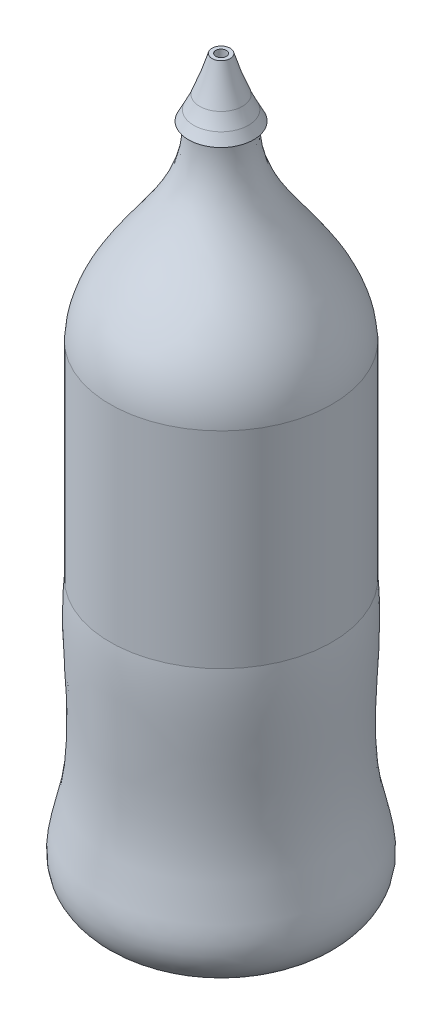
ISO-10303-21;
HEADER;
FILE_DESCRIPTION(('STEP AP214'),'2;1');
FILE_NAME('part.step','',(''),(''),'','','');
FILE_SCHEMA(('AUTOMOTIVE_DESIGN { 1 0 10303 214 1 1 1 1 }'));
ENDSEC;
DATA;
#1=APPLICATION_CONTEXT('core data for automotive mechanical design processes');
#2=APPLICATION_PROTOCOL_DEFINITION('international standard','automotive_design',2000,#1);
#3=PRODUCT_CONTEXT('',#1,'mechanical');
#4=PRODUCT('Part','Part','',(#3));
#5=PRODUCT_RELATED_PRODUCT_CATEGORY('part','',(#4));
#6=PRODUCT_DEFINITION_FORMATION('','',#4);
#7=PRODUCT_DEFINITION_CONTEXT('part definition',#1,'design');
#8=PRODUCT_DEFINITION('design','',#6,#7);
#9=PRODUCT_DEFINITION_SHAPE('','',#8);
#10=(LENGTH_UNIT() NAMED_UNIT(*) SI_UNIT(.MILLI.,.METRE.));
#11=(NAMED_UNIT(*) PLANE_ANGLE_UNIT() SI_UNIT($,.RADIAN.));
#12=(NAMED_UNIT(*) SI_UNIT($,.STERADIAN.) SOLID_ANGLE_UNIT());
#13=UNCERTAINTY_MEASURE_WITH_UNIT(LENGTH_MEASURE(1.E-05),#10,'distance_accuracy_value','');
#14=(GEOMETRIC_REPRESENTATION_CONTEXT(3) GLOBAL_UNCERTAINTY_ASSIGNED_CONTEXT((#13)) GLOBAL_UNIT_ASSIGNED_CONTEXT((#10,
#11,#12)) REPRESENTATION_CONTEXT('',''));
#15=CARTESIAN_POINT('',(0.,0.,0.));
#16=DIRECTION('',(0.,0.,1.));
#17=DIRECTION('',(1.,0.,0.));
#18=AXIS2_PLACEMENT_3D('',#15,#16,#17);
#19=CARTESIAN_POINT('',(0.,0.,0.));
#20=DIRECTION('',(0.,-1.,0.));
#21=DIRECTION('',(0.,0.,-1.));
#22=AXIS2_PLACEMENT_3D('',#19,#20,#21);
#23=PLANE('',#22);
#24=CARTESIAN_POINT('',(0.,0.,0.));
#25=DIRECTION('',(0.,-1.,0.));
#26=DIRECTION('',(0.,0.,-1.));
#27=AXIS2_PLACEMENT_3D('',#24,#25,#26);
#28=CIRCLE('',#27,44.2878933126707);
#29=CARTESIAN_POINT('',(0.,0.,-44.2878933126707));
#30=VERTEX_POINT('',#29);
#31=EDGE_CURVE('E10',#30,#30,#28,.T.);
#32=ORIENTED_EDGE('',*,*,#31,.T.);
#33=EDGE_LOOP('',(#32));
#34=FACE_BOUND('',#33,.T.);
#35=ADVANCED_FACE('F35',(#34),#23,.T.);
#36=CARTESIAN_POINT('',(44.2878933126707,0.,0.));
#37=CARTESIAN_POINT('',(64.997390407619,10.7682458448308,0.));
#38=CARTESIAN_POINT('',(44.2480995941427,56.60135594638,0.));
#39=CARTESIAN_POINT('',(55.2454776336469,101.880070942648,0.));
#40=CARTESIAN_POINT('',(52.5674885243035,132.323370386274,0.));
#41=B_SPLINE_CURVE_WITH_KNOTS('',3,(#36,#37,#38,#39,#40),.UNSPECIFIED.,.F.,.F.,(4,1,4),(0.,
0.337509044178873,1.),.UNSPECIFIED.);
#42=CARTESIAN_POINT('',(0.,0.,0.));
#43=DIRECTION('',(0.,-1.,0.));
#44=AXIS1_PLACEMENT('',#42,#43);
#45=SURFACE_OF_REVOLUTION('',#41,#44);
#46=CARTESIAN_POINT('',(0.,132.323370386274,0.));
#47=DIRECTION('',(0.,-1.,0.));
#48=DIRECTION('',(0.,0.,-1.));
#49=AXIS2_PLACEMENT_3D('',#46,#47,#48);
#50=CIRCLE('',#49,52.5674885243035);
#51=CARTESIAN_POINT('',(0.,132.323370386274,-52.5674885243035));
#52=VERTEX_POINT('',#51);
#53=EDGE_CURVE('E41',#52,#52,#50,.T.);
#54=ORIENTED_EDGE('',*,*,#53,.T.);
#55=EDGE_LOOP('',(#54));
#56=FACE_BOUND('',#55,.T.);
#57=ORIENTED_EDGE('',*,*,#31,.F.);
#58=EDGE_LOOP('',(#57));
#59=FACE_BOUND('',#58,.T.);
#60=ADVANCED_FACE('F76',(#56,#59),#45,.F.);
#61=CARTESIAN_POINT('',(0.,0.,0.));
#62=DIRECTION('',(0.,-1.,0.));
#63=DIRECTION('',(0.,0.,-1.));
#64=AXIS2_PLACEMENT_3D('',#61,#62,#63);
#65=CYLINDRICAL_SURFACE('',#64,52.5674885243035);
#66=CARTESIAN_POINT('',(0.,229.937180408608,0.));
#67=DIRECTION('',(0.,-1.,0.));
#68=DIRECTION('',(0.,0.,-1.));
#69=AXIS2_PLACEMENT_3D('',#66,#67,#68);
#70=CIRCLE('',#69,52.5674885243035);
#71=CARTESIAN_POINT('',(0.,229.937180408608,-52.5674885243035));
#72=VERTEX_POINT('',#71);
#73=EDGE_CURVE('E45',#72,#72,#70,.T.);
#74=ORIENTED_EDGE('',*,*,#73,.T.);
#75=EDGE_LOOP('',(#74));
#76=FACE_BOUND('',#75,.T.);
#77=ORIENTED_EDGE('',*,*,#53,.F.);
#78=EDGE_LOOP('',(#77));
#79=FACE_BOUND('',#78,.T.);
#80=ADVANCED_FACE('F72',(#76,#79),#65,.T.);
#81=CARTESIAN_POINT('',(52.5674885243035,229.937180408608,0.));
#82=CARTESIAN_POINT('',(50.721966152257,265.475319411819,0.));
#83=CARTESIAN_POINT('',(11.8780918355514,283.278325470359,0.));
#84=CARTESIAN_POINT('',(13.,320.,0.));
#85=B_SPLINE_CURVE_WITH_KNOTS('',3,(#81,#82,#83,#84),.UNSPECIFIED.,.F.,.F.,(4,4),(0.,1.),.UNSPECIFIED.);
#86=CARTESIAN_POINT('',(0.,0.,0.));
#87=DIRECTION('',(0.,-1.,0.));
#88=AXIS1_PLACEMENT('',#86,#87);
#89=SURFACE_OF_REVOLUTION('',#85,#88);
#90=CARTESIAN_POINT('',(0.,320.,0.));
#91=DIRECTION('',(0.,-1.,0.));
#92=DIRECTION('',(0.,0.,-1.));
#93=AXIS2_PLACEMENT_3D('',#90,#91,#92);
#94=CIRCLE('',#93,13.);
#95=CARTESIAN_POINT('',(0.,320.,-13.));
#96=VERTEX_POINT('',#95);
#97=EDGE_CURVE('E49',#96,#96,#94,.T.);
#98=ORIENTED_EDGE('',*,*,#97,.T.);
#99=EDGE_LOOP('',(#98));
#100=FACE_BOUND('',#99,.T.);
#101=ORIENTED_EDGE('',*,*,#73,.F.);
#102=EDGE_LOOP('',(#101));
#103=FACE_BOUND('',#102,.T.);
#104=ADVANCED_FACE('F67',(#100,#103),#89,.F.);
#105=CARTESIAN_POINT('',(15.433464657022,320.,0.));
#106=DIRECTION('',(0.,-1.,0.));
#107=DIRECTION('',(0.,0.,-1.));
#108=AXIS2_PLACEMENT_3D('',#105,#106,#107);
#109=PLANE('',#108);
#110=CARTESIAN_POINT('',(0.,320.,0.));
#111=DIRECTION('',(0.,1.,0.));
#112=DIRECTION('',(-1.,0.,0.));
#113=AXIS2_PLACEMENT_3D('',#110,#111,#112);
#114=CIRCLE('',#113,15.433464657022);
#115=CARTESIAN_POINT('',(-15.433464657022,320.,0.));
#116=VERTEX_POINT('',#115);
#117=EDGE_CURVE('E54',#116,#116,#114,.T.);
#118=ORIENTED_EDGE('',*,*,#117,.F.);
#119=EDGE_LOOP('',(#118));
#120=FACE_BOUND('',#119,.T.);
#121=ORIENTED_EDGE('',*,*,#97,.F.);
#122=EDGE_LOOP('',(#121));
#123=FACE_BOUND('',#122,.T.);
#124=ADVANCED_FACE('F71',(#120,#123),#109,.T.);
#125=CARTESIAN_POINT('',(0.,383.511624279016,0.));
#126=DIRECTION('',(0.,1.,0.));
#127=DIRECTION('',(-1.,0.,0.));
#128=AXIS2_PLACEMENT_3D('',#125,#126,#127);
#129=DEGENERATE_TOROIDAL_SURFACE('',#128,133.383744729514,133.962662662916,.T.);
#130=CARTESIAN_POINT('',(0.,324.743018777121,0.));
#131=DIRECTION('',(0.,-1.,0.));
#132=DIRECTION('',(1.,0.,0.));
#133=AXIS2_PLACEMENT_3D('',#130,#131,#132);
#134=CIRCLE('',#133,13.);
#135=CARTESIAN_POINT('',(13.,324.743018777121,0.));
#136=VERTEX_POINT('',#135);
#137=EDGE_CURVE('E190',#136,#136,#134,.T.);
#138=ORIENTED_EDGE('',*,*,#137,.T.);
#139=EDGE_LOOP('',(#138));
#140=FACE_BOUND('',#139,.T.);
#141=ORIENTED_EDGE('',*,*,#117,.T.);
#142=EDGE_LOOP('',(#141));
#143=FACE_BOUND('',#142,.T.);
#144=ADVANCED_FACE('F112',(#140,#143),#129,.F.);
#145=CARTESIAN_POINT('',(9.91901574854125,331.054218753293,0.));
#146=DIRECTION('',(0.,1.,0.));
#147=DIRECTION('',(-1.,0.,0.));
#148=AXIS2_PLACEMENT_3D('',#145,#146,#147);
#149=PLANE('',#148);
#150=CARTESIAN_POINT('',(0.,331.054218753293,0.));
#151=DIRECTION('',(0.,-1.,0.));
#152=DIRECTION('',(1.,0.,0.));
#153=AXIS2_PLACEMENT_3D('',#150,#151,#152);
#154=CIRCLE('',#153,9.91901574854124);
#155=CARTESIAN_POINT('',(9.91901574854125,331.054218753293,0.));
#156=VERTEX_POINT('',#155);
#157=EDGE_CURVE('E194',#156,#156,#154,.T.);
#158=ORIENTED_EDGE('',*,*,#157,.F.);
#159=EDGE_LOOP('',(#158));
#160=FACE_BOUND('',#159,.T.);
#161=CARTESIAN_POINT('',(0.,331.054218753293,0.));
#162=DIRECTION('',(0.,-1.,0.));
#163=DIRECTION('',(1.,0.,0.));
#164=AXIS2_PLACEMENT_3D('',#161,#162,#163);
#165=CIRCLE('',#164,10.1189257694876);
#166=CARTESIAN_POINT('',(10.1189257694876,331.054218753293,0.));
#167=VERTEX_POINT('',#166);
#168=EDGE_CURVE('E201',#167,#167,#165,.F.);
#169=ORIENTED_EDGE('',*,*,#168,.F.);
#170=EDGE_LOOP('',(#169));
#171=FACE_BOUND('',#170,.T.);
#172=ADVANCED_FACE('F122',(#160,#171),#149,.F.);
#173=CARTESIAN_POINT('',(0.,356.803646010612,0.));
#174=DIRECTION('',(0.,-1.,0.));
#175=DIRECTION('',(1.,0.,0.));
#176=AXIS2_PLACEMENT_3D('',#173,#174,#175);
#177=TOROIDAL_SURFACE('',#176,70.6696148964327,65.9823332484365);
#178=ORIENTED_EDGE('',*,*,#137,.F.);
#179=EDGE_LOOP('',(#178));
#180=FACE_BOUND('',#179,.T.);
#181=ORIENTED_EDGE('',*,*,#157,.T.);
#182=EDGE_LOOP('',(#181));
#183=FACE_BOUND('',#182,.T.);
#184=ADVANCED_FACE('F145',(#180,#183),#177,.F.);
#185=CARTESIAN_POINT('',(4.28043344798618,347.757883161713,0.));
#186=DIRECTION('',(0.,-1.,0.));
#187=DIRECTION('',(1.,0.,0.));
#188=AXIS2_PLACEMENT_3D('',#185,#186,#187);
#189=PLANE('',#188);
#190=CARTESIAN_POINT('',(0.,347.757883161713,0.));
#191=DIRECTION('',(0.,1.,0.));
#192=DIRECTION('',(-1.,0.,0.));
#193=AXIS2_PLACEMENT_3D('',#190,#191,#192);
#194=CIRCLE('',#193,2.5);
#195=CARTESIAN_POINT('',(-2.49999999999994,347.757883161713,0.));
#196=VERTEX_POINT('',#195);
#197=EDGE_CURVE('E191',#196,#196,#194,.T.);
#198=ORIENTED_EDGE('',*,*,#197,.F.);
#199=EDGE_LOOP('',(#198));
#200=FACE_BOUND('',#199,.T.);
#201=CARTESIAN_POINT('',(0.,347.757883161713,0.));
#202=DIRECTION('',(0.,1.,0.));
#203=DIRECTION('',(-1.,0.,0.));
#204=AXIS2_PLACEMENT_3D('',#201,#202,#203);
#205=CIRCLE('',#204,4.28043344798618);
#206=CARTESIAN_POINT('',(-4.28043344798617,347.757883161713,0.));
#207=VERTEX_POINT('',#206);
#208=EDGE_CURVE('E204',#207,#207,#205,.T.);
#209=ORIENTED_EDGE('',*,*,#208,.T.);
#210=EDGE_LOOP('',(#209));
#211=FACE_BOUND('',#210,.T.);
#212=ADVANCED_FACE('F135',(#200,#211),#189,.F.);
#213=ORIENTED_EDGE('',*,*,#168,.T.);
#214=EDGE_LOOP('',(#213));
#215=FACE_BOUND('',#214,.T.);
#216=ORIENTED_EDGE('',*,*,#208,.F.);
#217=EDGE_LOOP('',(#216));
#218=FACE_BOUND('',#217,.T.);
#219=ADVANCED_FACE('F124',(#215,#218),#129,.F.);
#220=CARTESIAN_POINT('',(0.,337.757883161713,0.));
#221=DIRECTION('',(0.,1.,0.));
#222=DIRECTION('',(-1.,0.,0.));
#223=AXIS2_PLACEMENT_3D('',#220,#221,#222);
#224=CYLINDRICAL_SURFACE('',#223,2.5);
#225=CARTESIAN_POINT('',(0.,337.757883161713,0.));
#226=DIRECTION('',(0.,1.,0.));
#227=DIRECTION('',(-1.,0.,0.));
#228=AXIS2_PLACEMENT_3D('',#225,#226,#227);
#229=CIRCLE('',#228,2.5);
#230=CARTESIAN_POINT('',(-2.49999999999994,337.757883161713,0.));
#231=VERTEX_POINT('',#230);
#232=EDGE_CURVE('E189',#231,#231,#229,.T.);
#233=ORIENTED_EDGE('',*,*,#232,.F.);
#234=EDGE_LOOP('',(#233));
#235=FACE_BOUND('',#234,.T.);
#236=ORIENTED_EDGE('',*,*,#197,.T.);
#237=EDGE_LOOP('',(#236));
#238=FACE_BOUND('',#237,.T.);
#239=ADVANCED_FACE('F134',(#235,#238),#224,.F.);
#240=CARTESIAN_POINT('',(0.,337.757883161713,0.));
#241=DIRECTION('',(0.,1.,0.));
#242=DIRECTION('',(-1.,0.,0.));
#243=AXIS2_PLACEMENT_3D('',#240,#241,#242);
#244=PLANE('',#243);
#245=ORIENTED_EDGE('',*,*,#232,.T.);
#246=EDGE_LOOP('',(#245));
#247=FACE_BOUND('',#246,.T.);
#248=ADVANCED_FACE('F173',(#247),#244,.T.);
#249=CLOSED_SHELL('',(#35,#60,#80,#104,#124,#144,#172,#184,#212,#219,#239,#248));
#250=MANIFOLD_SOLID_BREP('B2',#249);
#251=ADVANCED_BREP_SHAPE_REPRESENTATION('',(#18,#250),#14);
#252=SHAPE_DEFINITION_REPRESENTATION(#9,#251);
ENDSEC;
END-ISO-10303-21;
